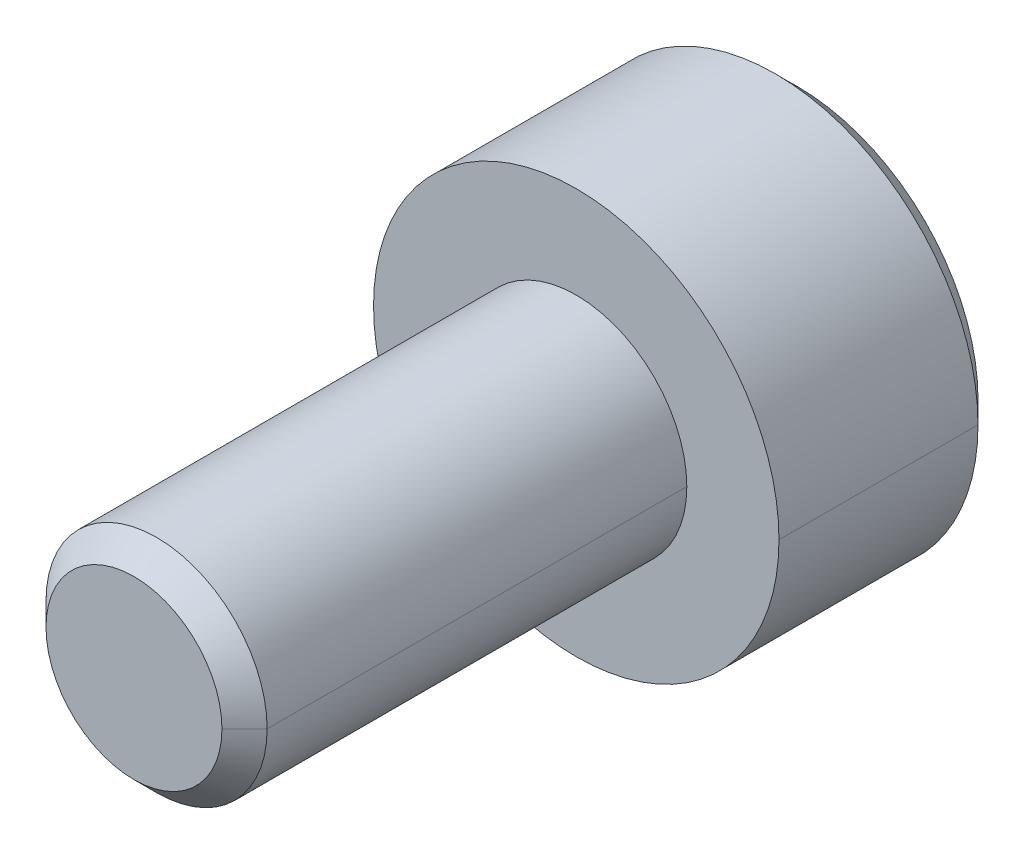
ISO-10303-21;
HEADER;
FILE_DESCRIPTION(('STEP AP214'),'2;1');
FILE_NAME('part.step','',(''),(''),'','','');
FILE_SCHEMA(('AUTOMOTIVE_DESIGN { 1 0 10303 214 1 1 1 1 }'));
ENDSEC;
DATA;
#1=APPLICATION_CONTEXT('core data for automotive mechanical design processes');
#2=APPLICATION_PROTOCOL_DEFINITION('international standard','automotive_design',2000,#1);
#3=PRODUCT_CONTEXT('',#1,'mechanical');
#4=PRODUCT('Part','Part','',(#3));
#5=PRODUCT_RELATED_PRODUCT_CATEGORY('part','',(#4));
#6=PRODUCT_DEFINITION_FORMATION('','',#4);
#7=PRODUCT_DEFINITION_CONTEXT('part definition',#1,'design');
#8=PRODUCT_DEFINITION('design','',#6,#7);
#9=PRODUCT_DEFINITION_SHAPE('','',#8);
#10=(LENGTH_UNIT() NAMED_UNIT(*) SI_UNIT(.MILLI.,.METRE.));
#11=(NAMED_UNIT(*) PLANE_ANGLE_UNIT() SI_UNIT($,.RADIAN.));
#12=(NAMED_UNIT(*) SI_UNIT($,.STERADIAN.) SOLID_ANGLE_UNIT());
#13=UNCERTAINTY_MEASURE_WITH_UNIT(LENGTH_MEASURE(1.E-05),#10,'distance_accuracy_value','');
#14=(GEOMETRIC_REPRESENTATION_CONTEXT(3) GLOBAL_UNCERTAINTY_ASSIGNED_CONTEXT((#13)) GLOBAL_UNIT_ASSIGNED_CONTEXT((#10,
#11,#12)) REPRESENTATION_CONTEXT('',''));
#15=CARTESIAN_POINT('',(0.,0.,0.));
#16=DIRECTION('',(0.,0.,1.));
#17=DIRECTION('',(1.,0.,0.));
#18=AXIS2_PLACEMENT_3D('',#15,#16,#17);
#19=CARTESIAN_POINT('',(0.,0.,1.3));
#20=DIRECTION('',(0.,0.,-1.));
#21=DIRECTION('',(0.,-1.,0.));
#22=AXIS2_PLACEMENT_3D('',#19,#20,#21);
#23=PLANE('',#22);
#24=DIRECTION('',(0.866025403784439,0.5,0.));
#25=VECTOR('',#24,1.);
#26=CARTESIAN_POINT('',(-1.25,0.721687836487033,1.3));
#27=LINE('',#26,#25);
#28=CARTESIAN_POINT('',(-1.25,0.721687836487033,1.3));
#29=VERTEX_POINT('',#28);
#30=CARTESIAN_POINT('',(0.,1.44337567297406,1.3));
#31=VERTEX_POINT('',#30);
#32=EDGE_CURVE('E142',#29,#31,#27,.T.);
#33=ORIENTED_EDGE('',*,*,#32,.T.);
#34=DIRECTION('',(0.866025403784439,-0.5,0.));
#35=VECTOR('',#34,1.);
#36=CARTESIAN_POINT('',(0.,1.44337567297406,1.3));
#37=LINE('',#36,#35);
#38=CARTESIAN_POINT('',(1.25,0.721687836487033,1.3));
#39=VERTEX_POINT('',#38);
#40=EDGE_CURVE('E9',#31,#39,#37,.T.);
#41=ORIENTED_EDGE('',*,*,#40,.T.);
#42=DIRECTION('',(0.,-1.,0.));
#43=VECTOR('',#42,1.);
#44=CARTESIAN_POINT('',(1.25,0.721687836487033,1.3));
#45=LINE('',#44,#43);
#46=CARTESIAN_POINT('',(1.25,-0.721687836487033,1.3));
#47=VERTEX_POINT('',#46);
#48=EDGE_CURVE('E42',#39,#47,#45,.T.);
#49=ORIENTED_EDGE('',*,*,#48,.T.);
#50=DIRECTION('',(-0.866025403784439,-0.5,0.));
#51=VECTOR('',#50,1.);
#52=CARTESIAN_POINT('',(1.25,-0.721687836487033,1.3));
#53=LINE('',#52,#51);
#54=CARTESIAN_POINT('',(0.,-1.44337567297406,1.3));
#55=VERTEX_POINT('',#54);
#56=EDGE_CURVE('E205',#47,#55,#53,.T.);
#57=ORIENTED_EDGE('',*,*,#56,.T.);
#58=DIRECTION('',(-0.866025403784439,0.5,0.));
#59=VECTOR('',#58,1.);
#60=CARTESIAN_POINT('',(0.,-1.44337567297406,1.3));
#61=LINE('',#60,#59);
#62=CARTESIAN_POINT('',(-1.25,-0.721687836487033,1.3));
#63=VERTEX_POINT('',#62);
#64=EDGE_CURVE('E199',#55,#63,#61,.T.);
#65=ORIENTED_EDGE('',*,*,#64,.T.);
#66=DIRECTION('',(0.,1.,0.));
#67=VECTOR('',#66,1.);
#68=CARTESIAN_POINT('',(-1.25,-0.721687836487033,1.3));
#69=LINE('',#68,#67);
#70=EDGE_CURVE('E146',#63,#29,#69,.T.);
#71=ORIENTED_EDGE('',*,*,#70,.T.);
#72=EDGE_LOOP('',(#33,#41,#49,#57,#65,#71));
#73=FACE_BOUND('',#72,.T.);
#74=ADVANCED_FACE('F15',(#73),#23,.T.);
#75=CARTESIAN_POINT('',(0.,1.44337567297406,1.3));
#76=DIRECTION('',(0.5,0.866025403784439,0.));
#77=DIRECTION('',(0.,0.,-1.));
#78=AXIS2_PLACEMENT_3D('',#75,#76,#77);
#79=PLANE('',#78);
#80=DIRECTION('',(0.866025403784439,-0.5,0.));
#81=VECTOR('',#80,1.);
#82=CARTESIAN_POINT('',(0.,1.44337567297406,0.));
#83=LINE('',#82,#81);
#84=CARTESIAN_POINT('',(0.,1.44337567297406,0.));
#85=VERTEX_POINT('',#84);
#86=CARTESIAN_POINT('',(1.25,0.721687836487033,0.));
#87=VERTEX_POINT('',#86);
#88=EDGE_CURVE('E163',#85,#87,#83,.T.);
#89=ORIENTED_EDGE('',*,*,#88,.T.);
#90=DIRECTION('',(0.,0.,-1.));
#91=VECTOR('',#90,1.);
#92=CARTESIAN_POINT('',(1.25,0.721687836487033,1.3));
#93=LINE('',#92,#91);
#94=EDGE_CURVE('E23',#39,#87,#93,.T.);
#95=ORIENTED_EDGE('',*,*,#94,.F.);
#96=ORIENTED_EDGE('',*,*,#40,.F.);
#97=DIRECTION('',(0.,0.,-1.));
#98=VECTOR('',#97,1.);
#99=CARTESIAN_POINT('',(0.,1.44337567297406,1.3));
#100=LINE('',#99,#98);
#101=EDGE_CURVE('E190',#31,#85,#100,.T.);
#102=ORIENTED_EDGE('',*,*,#101,.T.);
#103=EDGE_LOOP('',(#89,#95,#96,#102));
#104=FACE_BOUND('',#103,.T.);
#105=ADVANCED_FACE('F499',(#104),#79,.F.);
#106=CARTESIAN_POINT('',(1.25,0.721687836487033,1.3));
#107=DIRECTION('',(1.,0.,0.));
#108=DIRECTION('',(0.,1.,0.));
#109=AXIS2_PLACEMENT_3D('',#106,#107,#108);
#110=PLANE('',#109);
#111=DIRECTION('',(0.,-1.,0.));
#112=VECTOR('',#111,1.);
#113=CARTESIAN_POINT('',(1.25,0.721687836487033,0.));
#114=LINE('',#113,#112);
#115=CARTESIAN_POINT('',(1.25,-0.721687836487033,0.));
#116=VERTEX_POINT('',#115);
#117=EDGE_CURVE('E177',#87,#116,#114,.T.);
#118=ORIENTED_EDGE('',*,*,#117,.T.);
#119=DIRECTION('',(0.,0.,-1.));
#120=VECTOR('',#119,1.);
#121=CARTESIAN_POINT('',(1.25,-0.721687836487033,1.3));
#122=LINE('',#121,#120);
#123=EDGE_CURVE('E208',#47,#116,#122,.T.);
#124=ORIENTED_EDGE('',*,*,#123,.F.);
#125=ORIENTED_EDGE('',*,*,#48,.F.);
#126=ORIENTED_EDGE('',*,*,#94,.T.);
#127=EDGE_LOOP('',(#118,#124,#125,#126));
#128=FACE_BOUND('',#127,.T.);
#129=ADVANCED_FACE('F503',(#128),#110,.F.);
#130=CARTESIAN_POINT('',(1.25,-0.721687836487033,1.3));
#131=DIRECTION('',(0.5,-0.866025403784439,0.));
#132=DIRECTION('',(0.,0.,-1.));
#133=AXIS2_PLACEMENT_3D('',#130,#131,#132);
#134=PLANE('',#133);
#135=DIRECTION('',(-0.866025403784439,-0.5,0.));
#136=VECTOR('',#135,1.);
#137=CARTESIAN_POINT('',(1.25,-0.721687836487033,0.));
#138=LINE('',#137,#136);
#139=CARTESIAN_POINT('',(0.,-1.44337567297406,0.));
#140=VERTEX_POINT('',#139);
#141=EDGE_CURVE('E176',#116,#140,#138,.T.);
#142=ORIENTED_EDGE('',*,*,#141,.T.);
#143=DIRECTION('',(0.,0.,-1.));
#144=VECTOR('',#143,1.);
#145=CARTESIAN_POINT('',(0.,-1.44337567297406,1.3));
#146=LINE('',#145,#144);
#147=EDGE_CURVE('E202',#55,#140,#146,.T.);
#148=ORIENTED_EDGE('',*,*,#147,.F.);
#149=ORIENTED_EDGE('',*,*,#56,.F.);
#150=ORIENTED_EDGE('',*,*,#123,.T.);
#151=EDGE_LOOP('',(#142,#148,#149,#150));
#152=FACE_BOUND('',#151,.T.);
#153=ADVANCED_FACE('F509',(#152),#134,.F.);
#154=CARTESIAN_POINT('',(0.,-1.44337567297406,1.3));
#155=DIRECTION('',(-0.5,-0.866025403784439,0.));
#156=DIRECTION('',(-0.866025403784439,0.5,0.));
#157=AXIS2_PLACEMENT_3D('',#154,#155,#156);
#158=PLANE('',#157);
#159=DIRECTION('',(-0.866025403784439,0.5,0.));
#160=VECTOR('',#159,1.);
#161=CARTESIAN_POINT('',(0.,-1.44337567297406,0.));
#162=LINE('',#161,#160);
#163=CARTESIAN_POINT('',(-1.25,-0.721687836487033,0.));
#164=VERTEX_POINT('',#163);
#165=EDGE_CURVE('E157',#140,#164,#162,.T.);
#166=ORIENTED_EDGE('',*,*,#165,.T.);
#167=DIRECTION('',(0.,0.,-1.));
#168=VECTOR('',#167,1.);
#169=CARTESIAN_POINT('',(-1.25,-0.721687836487033,1.3));
#170=LINE('',#169,#168);
#171=EDGE_CURVE('E152',#63,#164,#170,.T.);
#172=ORIENTED_EDGE('',*,*,#171,.F.);
#173=ORIENTED_EDGE('',*,*,#64,.F.);
#174=ORIENTED_EDGE('',*,*,#147,.T.);
#175=EDGE_LOOP('',(#166,#172,#173,#174));
#176=FACE_BOUND('',#175,.T.);
#177=ADVANCED_FACE('F512',(#176),#158,.F.);
#178=CARTESIAN_POINT('',(-1.25,-0.721687836487033,1.3));
#179=DIRECTION('',(-1.,0.,0.));
#180=DIRECTION('',(0.,0.,1.));
#181=AXIS2_PLACEMENT_3D('',#178,#179,#180);
#182=PLANE('',#181);
#183=DIRECTION('',(0.,1.,0.));
#184=VECTOR('',#183,1.);
#185=CARTESIAN_POINT('',(-1.25,-0.721687836487033,0.));
#186=LINE('',#185,#184);
#187=CARTESIAN_POINT('',(-1.25,0.721687836487033,0.));
#188=VERTEX_POINT('',#187);
#189=EDGE_CURVE('E149',#164,#188,#186,.T.);
#190=ORIENTED_EDGE('',*,*,#189,.T.);
#191=DIRECTION('',(0.,0.,-1.));
#192=VECTOR('',#191,1.);
#193=CARTESIAN_POINT('',(-1.25,0.721687836487033,1.3));
#194=LINE('',#193,#192);
#195=EDGE_CURVE('E135',#29,#188,#194,.T.);
#196=ORIENTED_EDGE('',*,*,#195,.F.);
#197=ORIENTED_EDGE('',*,*,#70,.F.);
#198=ORIENTED_EDGE('',*,*,#171,.T.);
#199=EDGE_LOOP('',(#190,#196,#197,#198));
#200=FACE_BOUND('',#199,.T.);
#201=ADVANCED_FACE('F150',(#200),#182,.F.);
#202=CARTESIAN_POINT('',(-1.25,0.721687836487033,1.3));
#203=DIRECTION('',(-0.5,0.866025403784439,0.));
#204=DIRECTION('',(0.,0.,1.));
#205=AXIS2_PLACEMENT_3D('',#202,#203,#204);
#206=PLANE('',#205);
#207=DIRECTION('',(0.866025403784439,0.5,0.));
#208=VECTOR('',#207,1.);
#209=CARTESIAN_POINT('',(-1.25,0.721687836487033,0.));
#210=LINE('',#209,#208);
#211=EDGE_CURVE('E140',#188,#85,#210,.T.);
#212=ORIENTED_EDGE('',*,*,#211,.T.);
#213=ORIENTED_EDGE('',*,*,#101,.F.);
#214=ORIENTED_EDGE('',*,*,#32,.F.);
#215=ORIENTED_EDGE('',*,*,#195,.T.);
#216=EDGE_LOOP('',(#212,#213,#214,#215));
#217=FACE_BOUND('',#216,.T.);
#218=ADVANCED_FACE('F137',(#217),#206,.F.);
#219=CARTESIAN_POINT('',(0.,0.,9.));
#220=DIRECTION('',(0.,0.,-1.));
#221=DIRECTION('',(-1.,0.,0.));
#222=AXIS2_PLACEMENT_3D('',#219,#220,#221);
#223=CONICAL_SURFACE('',#222,1.1935,0.785398163397446);
#224=DIRECTION('',(0.707106781186546,0.,-0.707106781186549));
#225=VECTOR('',#224,1.);
#226=CARTESIAN_POINT('',(1.1935,0.,9.));
#227=LINE('',#226,#225);
#228=CARTESIAN_POINT('',(1.1935,0.,9.));
#229=VERTEX_POINT('',#228);
#230=CARTESIAN_POINT('',(1.5,0.,8.6935));
#231=VERTEX_POINT('',#230);
#232=EDGE_CURVE('E416',#229,#231,#227,.T.);
#233=ORIENTED_EDGE('',*,*,#232,.F.);
#234=CARTESIAN_POINT('',(0.,0.,9.));
#235=DIRECTION('',(0.,0.,1.));
#236=DIRECTION('',(1.,0.,0.));
#237=AXIS2_PLACEMENT_3D('',#234,#235,#236);
#238=CIRCLE('',#237,1.1935);
#239=CARTESIAN_POINT('',(-1.1935,0.,9.));
#240=VERTEX_POINT('',#239);
#241=EDGE_CURVE('E187',#240,#229,#238,.T.);
#242=ORIENTED_EDGE('',*,*,#241,.F.);
#243=DIRECTION('',(-0.707106781186546,0.,-0.707106781186549));
#244=VECTOR('',#243,1.);
#245=CARTESIAN_POINT('',(-1.1935,0.,9.));
#246=LINE('',#245,#244);
#247=CARTESIAN_POINT('',(-1.5,0.,8.6935));
#248=VERTEX_POINT('',#247);
#249=EDGE_CURVE('E367',#240,#248,#246,.T.);
#250=ORIENTED_EDGE('',*,*,#249,.T.);
#251=CARTESIAN_POINT('',(0.,0.,8.6935));
#252=DIRECTION('',(0.,0.,-1.));
#253=DIRECTION('',(1.,0.,0.));
#254=AXIS2_PLACEMENT_3D('',#251,#252,#253);
#255=CIRCLE('',#254,1.5);
#256=EDGE_CURVE('E181',#231,#248,#255,.T.);
#257=ORIENTED_EDGE('',*,*,#256,.F.);
#258=EDGE_LOOP('',(#233,#242,#250,#257));
#259=FACE_BOUND('',#258,.T.);
#260=ADVANCED_FACE('F461',(#259),#223,.T.);
#261=CARTESIAN_POINT('',(0.,0.,0.3));
#262=DIRECTION('',(0.,0.,1.));
#263=DIRECTION('',(1.,0.,0.));
#264=AXIS2_PLACEMENT_3D('',#261,#262,#263);
#265=CONICAL_SURFACE('',#264,2.75,0.78539816339745);
#266=DIRECTION('',(-0.707106781186549,0.,0.707106781186547));
#267=VECTOR('',#266,1.);
#268=CARTESIAN_POINT('',(-2.75,0.,0.3));
#269=LINE('',#268,#267);
#270=CARTESIAN_POINT('',(-2.45,0.,0.));
#271=VERTEX_POINT('',#270);
#272=CARTESIAN_POINT('',(-2.75,0.,0.3));
#273=VERTEX_POINT('',#272);
#274=EDGE_CURVE('E351',#271,#273,#269,.T.);
#275=ORIENTED_EDGE('',*,*,#274,.F.);
#276=CARTESIAN_POINT('',(0.,0.,0.));
#277=DIRECTION('',(0.,0.,-1.));
#278=DIRECTION('',(1.,0.,0.));
#279=AXIS2_PLACEMENT_3D('',#276,#277,#278);
#280=CIRCLE('',#279,2.45);
#281=CARTESIAN_POINT('',(2.45,0.,0.));
#282=VERTEX_POINT('',#281);
#283=EDGE_CURVE('E170',#282,#271,#280,.T.);
#284=ORIENTED_EDGE('',*,*,#283,.F.);
#285=DIRECTION('',(0.707106781186549,0.,0.707106781186547));
#286=VECTOR('',#285,1.);
#287=CARTESIAN_POINT('',(2.75,0.,0.3));
#288=LINE('',#287,#286);
#289=CARTESIAN_POINT('',(2.75,0.,0.3));
#290=VERTEX_POINT('',#289);
#291=EDGE_CURVE('E342',#282,#290,#288,.T.);
#292=ORIENTED_EDGE('',*,*,#291,.T.);
#293=CARTESIAN_POINT('',(0.,0.,0.3));
#294=DIRECTION('',(0.,0.,1.));
#295=DIRECTION('',(1.,0.,0.));
#296=AXIS2_PLACEMENT_3D('',#293,#294,#295);
#297=CIRCLE('',#296,2.75);
#298=EDGE_CURVE('E306',#273,#290,#297,.T.);
#299=ORIENTED_EDGE('',*,*,#298,.F.);
#300=EDGE_LOOP('',(#275,#284,#292,#299));
#301=FACE_BOUND('',#300,.T.);
#302=ADVANCED_FACE('F488',(#301),#265,.T.);
#303=CARTESIAN_POINT('',(0.,0.,9.));
#304=DIRECTION('',(0.,0.,1.));
#305=DIRECTION('',(1.,0.,0.));
#306=AXIS2_PLACEMENT_3D('',#303,#304,#305);
#307=PLANE('',#306);
#308=ORIENTED_EDGE('',*,*,#241,.T.);
#309=CARTESIAN_POINT('',(0.,0.,9.));
#310=DIRECTION('',(0.,0.,1.));
#311=DIRECTION('',(1.,0.,0.));
#312=AXIS2_PLACEMENT_3D('',#309,#310,#311);
#313=CIRCLE('',#312,1.1935);
#314=EDGE_CURVE('E424',#229,#240,#313,.T.);
#315=ORIENTED_EDGE('',*,*,#314,.T.);
#316=EDGE_LOOP('',(#308,#315));
#317=FACE_BOUND('',#316,.T.);
#318=ADVANCED_FACE('F454',(#317),#307,.T.);
#319=CARTESIAN_POINT('',(0.,0.,9.));
#320=DIRECTION('',(0.,0.,-1.));
#321=DIRECTION('',(-1.,0.,0.));
#322=AXIS2_PLACEMENT_3D('',#319,#320,#321);
#323=CYLINDRICAL_SURFACE('',#322,1.5);
#324=DIRECTION('',(0.,0.,-1.));
#325=VECTOR('',#324,1.);
#326=CARTESIAN_POINT('',(1.5,0.,9.));
#327=LINE('',#326,#325);
#328=CARTESIAN_POINT('',(1.5,0.,3.));
#329=VERTEX_POINT('',#328);
#330=EDGE_CURVE('E334',#231,#329,#327,.T.);
#331=ORIENTED_EDGE('',*,*,#330,.F.);
#332=ORIENTED_EDGE('',*,*,#256,.T.);
#333=DIRECTION('',(0.,0.,-1.));
#334=VECTOR('',#333,1.);
#335=CARTESIAN_POINT('',(-1.5,0.,9.));
#336=LINE('',#335,#334);
#337=CARTESIAN_POINT('',(-1.5,0.,3.));
#338=VERTEX_POINT('',#337);
#339=EDGE_CURVE('E320',#248,#338,#336,.T.);
#340=ORIENTED_EDGE('',*,*,#339,.T.);
#341=CARTESIAN_POINT('',(0.,0.,3.));
#342=DIRECTION('',(0.,0.,1.));
#343=DIRECTION('',(1.,0.,0.));
#344=AXIS2_PLACEMENT_3D('',#341,#342,#343);
#345=CIRCLE('',#344,1.5);
#346=EDGE_CURVE('E299',#338,#329,#345,.T.);
#347=ORIENTED_EDGE('',*,*,#346,.T.);
#348=EDGE_LOOP('',(#331,#332,#340,#347));
#349=FACE_BOUND('',#348,.T.);
#350=ADVANCED_FACE('F465',(#349),#323,.T.);
#351=CARTESIAN_POINT('',(0.,0.,0.));
#352=DIRECTION('',(0.,0.,1.));
#353=DIRECTION('',(1.,0.,0.));
#354=AXIS2_PLACEMENT_3D('',#351,#352,#353);
#355=PLANE('',#354);
#356=ORIENTED_EDGE('',*,*,#88,.F.);
#357=ORIENTED_EDGE('',*,*,#211,.F.);
#358=ORIENTED_EDGE('',*,*,#189,.F.);
#359=ORIENTED_EDGE('',*,*,#165,.F.);
#360=ORIENTED_EDGE('',*,*,#141,.F.);
#361=ORIENTED_EDGE('',*,*,#117,.F.);
#362=EDGE_LOOP('',(#356,#357,#358,#359,#360,#361));
#363=FACE_BOUND('',#362,.T.);
#364=ORIENTED_EDGE('',*,*,#283,.T.);
#365=CARTESIAN_POINT('',(0.,0.,0.));
#366=DIRECTION('',(0.,0.,-1.));
#367=DIRECTION('',(1.,0.,0.));
#368=AXIS2_PLACEMENT_3D('',#365,#366,#367);
#369=CIRCLE('',#368,2.45);
#370=EDGE_CURVE('E359',#271,#282,#369,.T.);
#371=ORIENTED_EDGE('',*,*,#370,.T.);
#372=EDGE_LOOP('',(#364,#371));
#373=FACE_BOUND('',#372,.T.);
#374=ADVANCED_FACE('F159',(#363,#373),#355,.F.);
#375=CARTESIAN_POINT('',(0.,0.,3.));
#376=DIRECTION('',(0.,0.,1.));
#377=DIRECTION('',(1.,0.,0.));
#378=AXIS2_PLACEMENT_3D('',#375,#376,#377);
#379=PLANE('',#378);
#380=ORIENTED_EDGE('',*,*,#346,.F.);
#381=CARTESIAN_POINT('',(0.,0.,3.));
#382=DIRECTION('',(0.,0.,1.));
#383=DIRECTION('',(1.,0.,0.));
#384=AXIS2_PLACEMENT_3D('',#381,#382,#383);
#385=CIRCLE('',#384,1.5);
#386=EDGE_CURVE('E326',#329,#338,#385,.T.);
#387=ORIENTED_EDGE('',*,*,#386,.F.);
#388=EDGE_LOOP('',(#380,#387));
#389=FACE_BOUND('',#388,.T.);
#390=CARTESIAN_POINT('',(0.,0.,3.));
#391=DIRECTION('',(0.,0.,1.));
#392=DIRECTION('',(1.,0.,0.));
#393=AXIS2_PLACEMENT_3D('',#390,#391,#392);
#394=CIRCLE('',#393,2.75);
#395=CARTESIAN_POINT('',(-2.75,0.,3.));
#396=VERTEX_POINT('',#395);
#397=CARTESIAN_POINT('',(2.75,0.,3.));
#398=VERTEX_POINT('',#397);
#399=EDGE_CURVE('E315',#396,#398,#394,.T.);
#400=ORIENTED_EDGE('',*,*,#399,.T.);
#401=CARTESIAN_POINT('',(0.,0.,3.));
#402=DIRECTION('',(0.,0.,1.));
#403=DIRECTION('',(1.,0.,0.));
#404=AXIS2_PLACEMENT_3D('',#401,#402,#403);
#405=CIRCLE('',#404,2.75);
#406=EDGE_CURVE('E325',#398,#396,#405,.T.);
#407=ORIENTED_EDGE('',*,*,#406,.T.);
#408=EDGE_LOOP('',(#400,#407));
#409=FACE_BOUND('',#408,.T.);
#410=ADVANCED_FACE('F470',(#389,#409),#379,.T.);
#411=CARTESIAN_POINT('',(0.,0.,3.));
#412=DIRECTION('',(0.,0.,-1.));
#413=DIRECTION('',(-1.,0.,0.));
#414=AXIS2_PLACEMENT_3D('',#411,#412,#413);
#415=CYLINDRICAL_SURFACE('',#414,2.75);
#416=DIRECTION('',(0.,0.,-1.));
#417=VECTOR('',#416,1.);
#418=CARTESIAN_POINT('',(2.75,0.,3.));
#419=LINE('',#418,#417);
#420=EDGE_CURVE('E316',#398,#290,#419,.T.);
#421=ORIENTED_EDGE('',*,*,#420,.F.);
#422=ORIENTED_EDGE('',*,*,#399,.F.);
#423=DIRECTION('',(0.,0.,-1.));
#424=VECTOR('',#423,1.);
#425=CARTESIAN_POINT('',(-2.75,0.,3.));
#426=LINE('',#425,#424);
#427=EDGE_CURVE('E310',#396,#273,#426,.T.);
#428=ORIENTED_EDGE('',*,*,#427,.T.);
#429=ORIENTED_EDGE('',*,*,#298,.T.);
#430=EDGE_LOOP('',(#421,#422,#428,#429));
#431=FACE_BOUND('',#430,.T.);
#432=ADVANCED_FACE('F473',(#431),#415,.T.);
#433=CARTESIAN_POINT('',(0.,0.,3.));
#434=DIRECTION('',(0.,0.,-1.));
#435=DIRECTION('',(-1.,0.,0.));
#436=AXIS2_PLACEMENT_3D('',#433,#434,#435);
#437=CYLINDRICAL_SURFACE('',#436,2.75);
#438=ORIENTED_EDGE('',*,*,#406,.F.);
#439=ORIENTED_EDGE('',*,*,#420,.T.);
#440=CARTESIAN_POINT('',(0.,0.,0.3));
#441=DIRECTION('',(0.,0.,1.));
#442=DIRECTION('',(1.,0.,0.));
#443=AXIS2_PLACEMENT_3D('',#440,#441,#442);
#444=CIRCLE('',#443,2.75);
#445=EDGE_CURVE('E346',#290,#273,#444,.T.);
#446=ORIENTED_EDGE('',*,*,#445,.T.);
#447=ORIENTED_EDGE('',*,*,#427,.F.);
#448=EDGE_LOOP('',(#438,#439,#446,#447));
#449=FACE_BOUND('',#448,.T.);
#450=ADVANCED_FACE('F480',(#449),#437,.T.);
#451=CARTESIAN_POINT('',(0.,0.,9.));
#452=DIRECTION('',(0.,0.,-1.));
#453=DIRECTION('',(-1.,0.,0.));
#454=AXIS2_PLACEMENT_3D('',#451,#452,#453);
#455=CYLINDRICAL_SURFACE('',#454,1.5);
#456=CARTESIAN_POINT('',(0.,0.,8.6935));
#457=DIRECTION('',(0.,0.,-1.));
#458=DIRECTION('',(1.,0.,0.));
#459=AXIS2_PLACEMENT_3D('',#456,#457,#458);
#460=CIRCLE('',#459,1.5);
#461=EDGE_CURVE('E382',#248,#231,#460,.T.);
#462=ORIENTED_EDGE('',*,*,#461,.T.);
#463=ORIENTED_EDGE('',*,*,#330,.T.);
#464=ORIENTED_EDGE('',*,*,#386,.T.);
#465=ORIENTED_EDGE('',*,*,#339,.F.);
#466=EDGE_LOOP('',(#462,#463,#464,#465));
#467=FACE_BOUND('',#466,.T.);
#468=ADVANCED_FACE('F468',(#467),#455,.T.);
#469=CARTESIAN_POINT('',(0.,0.,0.3));
#470=DIRECTION('',(0.,0.,1.));
#471=DIRECTION('',(1.,0.,0.));
#472=AXIS2_PLACEMENT_3D('',#469,#470,#471);
#473=CONICAL_SURFACE('',#472,2.75,0.78539816339745);
#474=ORIENTED_EDGE('',*,*,#370,.F.);
#475=ORIENTED_EDGE('',*,*,#274,.T.);
#476=ORIENTED_EDGE('',*,*,#445,.F.);
#477=ORIENTED_EDGE('',*,*,#291,.F.);
#478=EDGE_LOOP('',(#474,#475,#476,#477));
#479=FACE_BOUND('',#478,.T.);
#480=ADVANCED_FACE('F486',(#479),#473,.T.);
#481=CARTESIAN_POINT('',(0.,0.,9.));
#482=DIRECTION('',(0.,0.,-1.));
#483=DIRECTION('',(-1.,0.,0.));
#484=AXIS2_PLACEMENT_3D('',#481,#482,#483);
#485=CONICAL_SURFACE('',#484,1.1935,0.785398163397446);
#486=ORIENTED_EDGE('',*,*,#314,.F.);
#487=ORIENTED_EDGE('',*,*,#232,.T.);
#488=ORIENTED_EDGE('',*,*,#461,.F.);
#489=ORIENTED_EDGE('',*,*,#249,.F.);
#490=EDGE_LOOP('',(#486,#487,#488,#489));
#491=FACE_BOUND('',#490,.T.);
#492=ADVANCED_FACE('F458',(#491),#485,.T.);
#493=CLOSED_SHELL('',(#74,#105,#129,#153,#177,#201,#218,#260,#302,#318,#350,#374,#410,#432,#450,
#468,#480,#492));
#494=MANIFOLD_SOLID_BREP('B1',#493);
#495=ADVANCED_BREP_SHAPE_REPRESENTATION('',(#18,#494),#14);
#496=SHAPE_DEFINITION_REPRESENTATION(#9,#495);
ENDSEC;
END-ISO-10303-21;
